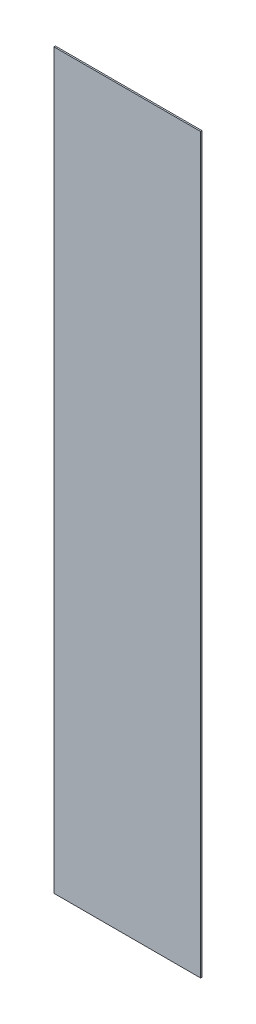
ISO-10303-21;
HEADER;
FILE_DESCRIPTION(('STEP AP214'),'2;1');
FILE_NAME('part.step','',(''),(''),'','','');
FILE_SCHEMA(('AUTOMOTIVE_DESIGN { 1 0 10303 214 1 1 1 1 }'));
ENDSEC;
DATA;
#1=APPLICATION_CONTEXT('core data for automotive mechanical design processes');
#2=APPLICATION_PROTOCOL_DEFINITION('international standard','automotive_design',2000,#1);
#3=PRODUCT_CONTEXT('',#1,'mechanical');
#4=PRODUCT('Part','Part','',(#3));
#5=PRODUCT_RELATED_PRODUCT_CATEGORY('part','',(#4));
#6=PRODUCT_DEFINITION_FORMATION('','',#4);
#7=PRODUCT_DEFINITION_CONTEXT('part definition',#1,'design');
#8=PRODUCT_DEFINITION('design','',#6,#7);
#9=PRODUCT_DEFINITION_SHAPE('','',#8);
#10=(LENGTH_UNIT() NAMED_UNIT(*) SI_UNIT(.MILLI.,.METRE.));
#11=(NAMED_UNIT(*) PLANE_ANGLE_UNIT() SI_UNIT($,.RADIAN.));
#12=(NAMED_UNIT(*) SI_UNIT($,.STERADIAN.) SOLID_ANGLE_UNIT());
#13=UNCERTAINTY_MEASURE_WITH_UNIT(LENGTH_MEASURE(1.E-05),#10,'distance_accuracy_value','');
#14=(GEOMETRIC_REPRESENTATION_CONTEXT(3) GLOBAL_UNCERTAINTY_ASSIGNED_CONTEXT((#13)) GLOBAL_UNIT_ASSIGNED_CONTEXT((#10,
#11,#12)) REPRESENTATION_CONTEXT('',''));
#15=CARTESIAN_POINT('',(0.,0.,0.));
#16=DIRECTION('',(0.,0.,1.));
#17=DIRECTION('',(1.,0.,0.));
#18=AXIS2_PLACEMENT_3D('',#15,#16,#17);
#19=CARTESIAN_POINT('',(-5.00000000000001,-25.,0.1));
#20=DIRECTION('',(-1.,0.,0.));
#21=DIRECTION('',(0.,0.,1.));
#22=AXIS2_PLACEMENT_3D('',#19,#20,#21);
#23=PLANE('',#22);
#24=DIRECTION('',(0.,1.,0.));
#25=VECTOR('',#24,1.);
#26=CARTESIAN_POINT('',(-5.00000000000001,-25.,0.));
#27=LINE('',#26,#25);
#28=CARTESIAN_POINT('',(-5.00000000000001,-25.,0.));
#29=VERTEX_POINT('',#28);
#30=CARTESIAN_POINT('',(-5.00000000000001,25.,0.));
#31=VERTEX_POINT('',#30);
#32=EDGE_CURVE('E100',#29,#31,#27,.T.);
#33=ORIENTED_EDGE('',*,*,#32,.F.);
#34=DIRECTION('',(0.,0.,-1.));
#35=VECTOR('',#34,1.);
#36=CARTESIAN_POINT('',(-5.00000000000001,-25.,0.1));
#37=LINE('',#36,#35);
#38=CARTESIAN_POINT('',(-5.00000000000001,-25.,0.1));
#39=VERTEX_POINT('',#38);
#40=EDGE_CURVE('E11',#39,#29,#37,.T.);
#41=ORIENTED_EDGE('',*,*,#40,.F.);
#42=DIRECTION('',(0.,1.,0.));
#43=VECTOR('',#42,1.);
#44=CARTESIAN_POINT('',(-5.00000000000001,-25.,0.1));
#45=LINE('',#44,#43);
#46=CARTESIAN_POINT('',(-5.00000000000001,25.,0.1));
#47=VERTEX_POINT('',#46);
#48=EDGE_CURVE('E95',#39,#47,#45,.T.);
#49=ORIENTED_EDGE('',*,*,#48,.T.);
#50=DIRECTION('',(0.,0.,-1.));
#51=VECTOR('',#50,1.);
#52=CARTESIAN_POINT('',(-5.00000000000001,25.,0.1));
#53=LINE('',#52,#51);
#54=EDGE_CURVE('E38',#47,#31,#53,.T.);
#55=ORIENTED_EDGE('',*,*,#54,.T.);
#56=EDGE_LOOP('',(#33,#41,#49,#55));
#57=FACE_BOUND('',#56,.T.);
#58=ADVANCED_FACE('F35',(#57),#23,.T.);
#59=CARTESIAN_POINT('',(-5.00000000000001,-25.,0.1));
#60=DIRECTION('',(0.,1.,0.));
#61=DIRECTION('',(0.,0.,1.));
#62=AXIS2_PLACEMENT_3D('',#59,#60,#61);
#63=PLANE('',#62);
#64=DIRECTION('',(1.,0.,0.));
#65=VECTOR('',#64,1.);
#66=CARTESIAN_POINT('',(-5.00000000000001,-25.,0.));
#67=LINE('',#66,#65);
#68=CARTESIAN_POINT('',(4.99999999999999,-25.,0.));
#69=VERTEX_POINT('',#68);
#70=EDGE_CURVE('E68',#29,#69,#67,.T.);
#71=ORIENTED_EDGE('',*,*,#70,.T.);
#72=DIRECTION('',(0.,0.,-1.));
#73=VECTOR('',#72,1.);
#74=CARTESIAN_POINT('',(4.99999999999999,-25.,0.1));
#75=LINE('',#74,#73);
#76=CARTESIAN_POINT('',(4.99999999999999,-25.,0.1));
#77=VERTEX_POINT('',#76);
#78=EDGE_CURVE('E44',#77,#69,#75,.T.);
#79=ORIENTED_EDGE('',*,*,#78,.F.);
#80=DIRECTION('',(1.,0.,0.));
#81=VECTOR('',#80,1.);
#82=CARTESIAN_POINT('',(-5.00000000000001,-25.,0.1));
#83=LINE('',#82,#81);
#84=EDGE_CURVE('E85',#39,#77,#83,.T.);
#85=ORIENTED_EDGE('',*,*,#84,.F.);
#86=ORIENTED_EDGE('',*,*,#40,.T.);
#87=EDGE_LOOP('',(#71,#79,#85,#86));
#88=FACE_BOUND('',#87,.T.);
#89=ADVANCED_FACE('F110',(#88),#63,.F.);
#90=CARTESIAN_POINT('',(4.99999999999999,-25.,0.1));
#91=DIRECTION('',(-1.,0.,0.));
#92=DIRECTION('',(0.,0.,1.));
#93=AXIS2_PLACEMENT_3D('',#90,#91,#92);
#94=PLANE('',#93);
#95=DIRECTION('',(0.,1.,0.));
#96=VECTOR('',#95,1.);
#97=CARTESIAN_POINT('',(4.99999999999999,-25.,0.));
#98=LINE('',#97,#96);
#99=CARTESIAN_POINT('',(4.99999999999999,25.,0.));
#100=VERTEX_POINT('',#99);
#101=EDGE_CURVE('E92',#69,#100,#98,.T.);
#102=ORIENTED_EDGE('',*,*,#101,.T.);
#103=DIRECTION('',(0.,0.,-1.));
#104=VECTOR('',#103,1.);
#105=CARTESIAN_POINT('',(4.99999999999999,25.,0.1));
#106=LINE('',#105,#104);
#107=CARTESIAN_POINT('',(4.99999999999999,25.,0.1));
#108=VERTEX_POINT('',#107);
#109=EDGE_CURVE('E89',#108,#100,#106,.T.);
#110=ORIENTED_EDGE('',*,*,#109,.F.);
#111=DIRECTION('',(0.,1.,0.));
#112=VECTOR('',#111,1.);
#113=CARTESIAN_POINT('',(4.99999999999999,-25.,0.1));
#114=LINE('',#113,#112);
#115=EDGE_CURVE('E80',#77,#108,#114,.T.);
#116=ORIENTED_EDGE('',*,*,#115,.F.);
#117=ORIENTED_EDGE('',*,*,#78,.T.);
#118=EDGE_LOOP('',(#102,#110,#116,#117));
#119=FACE_BOUND('',#118,.T.);
#120=ADVANCED_FACE('F90',(#119),#94,.F.);
#121=CARTESIAN_POINT('',(-5.00000000000001,25.,0.1));
#122=DIRECTION('',(0.,1.,0.));
#123=DIRECTION('',(0.,0.,1.));
#124=AXIS2_PLACEMENT_3D('',#121,#122,#123);
#125=PLANE('',#124);
#126=DIRECTION('',(1.,0.,0.));
#127=VECTOR('',#126,1.);
#128=CARTESIAN_POINT('',(-5.00000000000001,25.,0.));
#129=LINE('',#128,#127);
#130=EDGE_CURVE('E103',#31,#100,#129,.T.);
#131=ORIENTED_EDGE('',*,*,#130,.F.);
#132=ORIENTED_EDGE('',*,*,#54,.F.);
#133=DIRECTION('',(1.,0.,0.));
#134=VECTOR('',#133,1.);
#135=CARTESIAN_POINT('',(-5.00000000000001,25.,0.1));
#136=LINE('',#135,#134);
#137=EDGE_CURVE('E84',#47,#108,#136,.T.);
#138=ORIENTED_EDGE('',*,*,#137,.T.);
#139=ORIENTED_EDGE('',*,*,#109,.T.);
#140=EDGE_LOOP('',(#131,#132,#138,#139));
#141=FACE_BOUND('',#140,.T.);
#142=ADVANCED_FACE('F94',(#141),#125,.T.);
#143=CARTESIAN_POINT('',(0.,0.,0.1));
#144=DIRECTION('',(0.,0.,-1.));
#145=DIRECTION('',(-1.,0.,0.));
#146=AXIS2_PLACEMENT_3D('',#143,#144,#145);
#147=PLANE('',#146);
#148=ORIENTED_EDGE('',*,*,#48,.F.);
#149=ORIENTED_EDGE('',*,*,#84,.T.);
#150=ORIENTED_EDGE('',*,*,#115,.T.);
#151=ORIENTED_EDGE('',*,*,#137,.F.);
#152=EDGE_LOOP('',(#148,#149,#150,#151));
#153=FACE_BOUND('',#152,.T.);
#154=ADVANCED_FACE('F83',(#153),#147,.F.);
#155=CARTESIAN_POINT('',(0.,0.,0.));
#156=DIRECTION('',(0.,0.,-1.));
#157=DIRECTION('',(-1.,0.,0.));
#158=AXIS2_PLACEMENT_3D('',#155,#156,#157);
#159=PLANE('',#158);
#160=ORIENTED_EDGE('',*,*,#32,.T.);
#161=ORIENTED_EDGE('',*,*,#130,.T.);
#162=ORIENTED_EDGE('',*,*,#101,.F.);
#163=ORIENTED_EDGE('',*,*,#70,.F.);
#164=EDGE_LOOP('',(#160,#161,#162,#163));
#165=FACE_BOUND('',#164,.T.);
#166=ADVANCED_FACE('F108',(#165),#159,.T.);
#167=CLOSED_SHELL('',(#58,#89,#120,#142,#154,#166));
#168=MANIFOLD_SOLID_BREP('B2',#167);
#169=ADVANCED_BREP_SHAPE_REPRESENTATION('',(#18,#168),#14);
#170=SHAPE_DEFINITION_REPRESENTATION(#9,#169);
ENDSEC;
END-ISO-10303-21;
